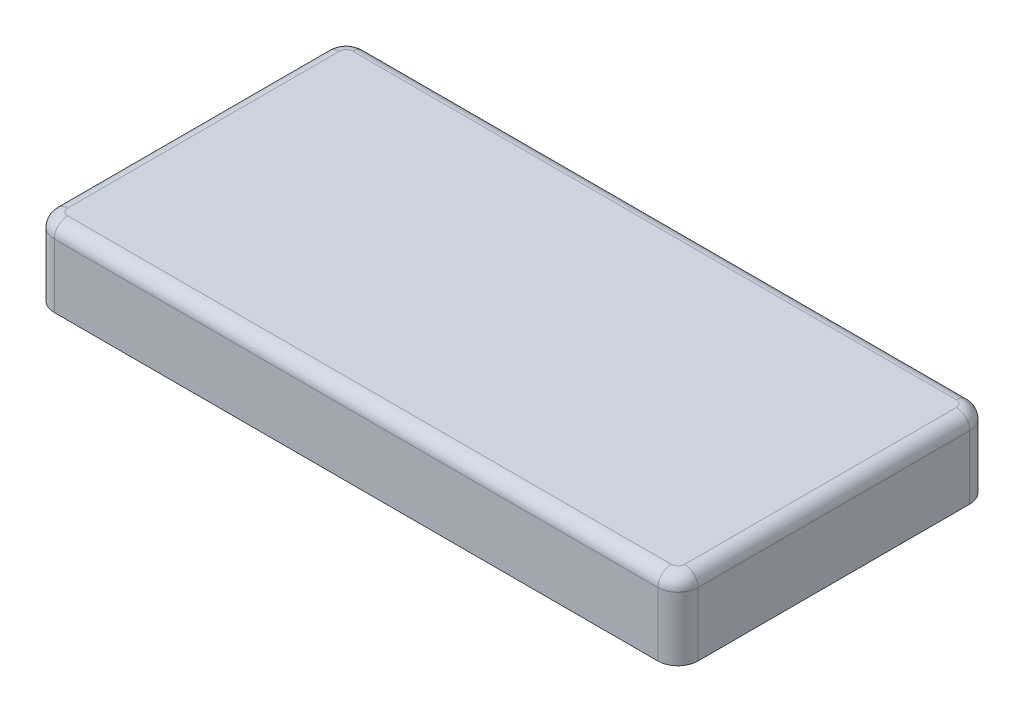
ISO-10303-21;
HEADER;
FILE_DESCRIPTION(('STEP AP214'),'2;1');
FILE_NAME('part.step','',(''),(''),'','','');
FILE_SCHEMA(('AUTOMOTIVE_DESIGN { 1 0 10303 214 1 1 1 1 }'));
ENDSEC;
DATA;
#1=APPLICATION_CONTEXT('core data for automotive mechanical design processes');
#2=APPLICATION_PROTOCOL_DEFINITION('international standard','automotive_design',2000,#1);
#3=PRODUCT_CONTEXT('',#1,'mechanical');
#4=PRODUCT('Part','Part','',(#3));
#5=PRODUCT_RELATED_PRODUCT_CATEGORY('part','',(#4));
#6=PRODUCT_DEFINITION_FORMATION('','',#4);
#7=PRODUCT_DEFINITION_CONTEXT('part definition',#1,'design');
#8=PRODUCT_DEFINITION('design','',#6,#7);
#9=PRODUCT_DEFINITION_SHAPE('','',#8);
#10=(LENGTH_UNIT() NAMED_UNIT(*) SI_UNIT(.MILLI.,.METRE.));
#11=(NAMED_UNIT(*) PLANE_ANGLE_UNIT() SI_UNIT($,.RADIAN.));
#12=(NAMED_UNIT(*) SI_UNIT($,.STERADIAN.) SOLID_ANGLE_UNIT());
#13=UNCERTAINTY_MEASURE_WITH_UNIT(LENGTH_MEASURE(1.E-05),#10,'distance_accuracy_value','');
#14=(GEOMETRIC_REPRESENTATION_CONTEXT(3) GLOBAL_UNCERTAINTY_ASSIGNED_CONTEXT((#13)) GLOBAL_UNIT_ASSIGNED_CONTEXT((#10,
#11,#12)) REPRESENTATION_CONTEXT('',''));
#15=CARTESIAN_POINT('',(0.,0.,0.));
#16=DIRECTION('',(0.,0.,1.));
#17=DIRECTION('',(1.,0.,0.));
#18=AXIS2_PLACEMENT_3D('',#15,#16,#17);
#19=CARTESIAN_POINT('',(0.,5.1,0.));
#20=DIRECTION('',(0.,1.,0.));
#21=DIRECTION('',(0.,0.,1.));
#22=AXIS2_PLACEMENT_3D('',#19,#20,#21);
#23=PLANE('',#22);
#24=DIRECTION('',(0.,0.,1.));
#25=VECTOR('',#24,1.);
#26=CARTESIAN_POINT('',(46.0375,5.1,0.));
#27=LINE('',#26,#25);
#28=CARTESIAN_POINT('',(46.0375,5.1,-20.2725));
#29=VERTEX_POINT('',#28);
#30=CARTESIAN_POINT('',(46.0375,5.1,20.2725));
#31=VERTEX_POINT('',#30);
#32=EDGE_CURVE('E345',#29,#31,#27,.T.);
#33=ORIENTED_EDGE('',*,*,#32,.T.);
#34=CARTESIAN_POINT('',(45.0375,5.1,20.2725));
#35=DIRECTION('',(0.,1.,0.));
#36=DIRECTION('',(0.,0.,1.));
#37=AXIS2_PLACEMENT_3D('',#34,#35,#36);
#38=CIRCLE('',#37,1.);
#39=CARTESIAN_POINT('',(45.0375,5.1,21.2725));
#40=VERTEX_POINT('',#39);
#41=EDGE_CURVE('E347',#31,#40,#38,.F.);
#42=ORIENTED_EDGE('',*,*,#41,.T.);
#43=DIRECTION('',(-1.,0.,0.));
#44=VECTOR('',#43,1.);
#45=CARTESIAN_POINT('',(0.,5.1,21.2725));
#46=LINE('',#45,#44);
#47=CARTESIAN_POINT('',(-45.0375,5.1,21.2725));
#48=VERTEX_POINT('',#47);
#49=EDGE_CURVE('E310',#40,#48,#46,.T.);
#50=ORIENTED_EDGE('',*,*,#49,.T.);
#51=CARTESIAN_POINT('',(-45.0375,5.1,20.2725));
#52=DIRECTION('',(0.,1.,0.));
#53=DIRECTION('',(0.,0.,1.));
#54=AXIS2_PLACEMENT_3D('',#51,#52,#53);
#55=CIRCLE('',#54,1.);
#56=CARTESIAN_POINT('',(-46.0375,5.1,20.2725));
#57=VERTEX_POINT('',#56);
#58=EDGE_CURVE('E335',#48,#57,#55,.F.);
#59=ORIENTED_EDGE('',*,*,#58,.T.);
#60=DIRECTION('',(0.,0.,-1.));
#61=VECTOR('',#60,1.);
#62=CARTESIAN_POINT('',(-46.0375,5.1,0.));
#63=LINE('',#62,#61);
#64=CARTESIAN_POINT('',(-46.0375,5.1,-20.2725));
#65=VERTEX_POINT('',#64);
#66=EDGE_CURVE('E337',#57,#65,#63,.T.);
#67=ORIENTED_EDGE('',*,*,#66,.T.);
#68=CARTESIAN_POINT('',(-45.0375,5.1,-20.2725));
#69=DIRECTION('',(0.,1.,0.));
#70=DIRECTION('',(0.,0.,1.));
#71=AXIS2_PLACEMENT_3D('',#68,#69,#70);
#72=CIRCLE('',#71,1.);
#73=CARTESIAN_POINT('',(-45.0375,5.1,-21.2725));
#74=VERTEX_POINT('',#73);
#75=EDGE_CURVE('E339',#65,#74,#72,.F.);
#76=ORIENTED_EDGE('',*,*,#75,.T.);
#77=DIRECTION('',(1.,0.,0.));
#78=VECTOR('',#77,1.);
#79=CARTESIAN_POINT('',(0.,5.1,-21.2725));
#80=LINE('',#79,#78);
#81=CARTESIAN_POINT('',(45.0375,5.1,-21.2725));
#82=VERTEX_POINT('',#81);
#83=EDGE_CURVE('E341',#74,#82,#80,.T.);
#84=ORIENTED_EDGE('',*,*,#83,.T.);
#85=CARTESIAN_POINT('',(45.0375,5.1,-20.2725));
#86=DIRECTION('',(0.,1.,0.));
#87=DIRECTION('',(0.,0.,1.));
#88=AXIS2_PLACEMENT_3D('',#85,#86,#87);
#89=CIRCLE('',#88,1.);
#90=EDGE_CURVE('E343',#82,#29,#89,.F.);
#91=ORIENTED_EDGE('',*,*,#90,.T.);
#92=EDGE_LOOP('',(#33,#42,#50,#59,#67,#76,#84,#91));
#93=FACE_BOUND('',#92,.T.);
#94=CARTESIAN_POINT('',(41.5925,5.1,16.8275));
#95=DIRECTION('',(0.,1.,0.));
#96=DIRECTION('',(0.,0.,1.));
#97=AXIS2_PLACEMENT_3D('',#94,#95,#96);
#98=CIRCLE('',#97,3.5);
#99=CARTESIAN_POINT('',(41.5925,5.1,20.3275));
#100=VERTEX_POINT('',#99);
#101=EDGE_CURVE('E422',#100,#100,#98,.F.);
#102=ORIENTED_EDGE('',*,*,#101,.F.);
#103=EDGE_LOOP('',(#102));
#104=FACE_BOUND('',#103,.T.);
#105=CARTESIAN_POINT('',(-41.5925,5.1,-16.8275));
#106=DIRECTION('',(0.,1.,0.));
#107=DIRECTION('',(0.,0.,1.));
#108=AXIS2_PLACEMENT_3D('',#105,#106,#107);
#109=CIRCLE('',#108,3.5);
#110=CARTESIAN_POINT('',(-41.5925,5.1,-13.3275));
#111=VERTEX_POINT('',#110);
#112=EDGE_CURVE('E434',#111,#111,#109,.T.);
#113=ORIENTED_EDGE('',*,*,#112,.T.);
#114=EDGE_LOOP('',(#113));
#115=FACE_BOUND('',#114,.T.);
#116=CARTESIAN_POINT('',(-41.5925,5.1,16.8275));
#117=DIRECTION('',(0.,1.,0.));
#118=DIRECTION('',(0.,0.,1.));
#119=AXIS2_PLACEMENT_3D('',#116,#117,#118);
#120=CIRCLE('',#119,3.5);
#121=CARTESIAN_POINT('',(-41.5925,5.1,20.3275));
#122=VERTEX_POINT('',#121);
#123=EDGE_CURVE('E428',#122,#122,#120,.F.);
#124=ORIENTED_EDGE('',*,*,#123,.F.);
#125=EDGE_LOOP('',(#124));
#126=FACE_BOUND('',#125,.T.);
#127=CARTESIAN_POINT('',(41.5925,5.1,-16.8275));
#128=DIRECTION('',(0.,1.,0.));
#129=DIRECTION('',(0.,0.,1.));
#130=AXIS2_PLACEMENT_3D('',#127,#128,#129);
#131=CIRCLE('',#130,3.5);
#132=CARTESIAN_POINT('',(41.5925,5.1,-13.3275));
#133=VERTEX_POINT('',#132);
#134=EDGE_CURVE('E232',#133,#133,#131,.F.);
#135=ORIENTED_EDGE('',*,*,#134,.F.);
#136=EDGE_LOOP('',(#135));
#137=FACE_BOUND('',#136,.T.);
#138=ADVANCED_FACE('F37',(#93,#104,#115,#126,#137),#23,.F.);
#139=CARTESIAN_POINT('',(-41.5925,6.6,-16.8275));
#140=DIRECTION('',(0.,-1.,0.));
#141=DIRECTION('',(0.,0.,-1.));
#142=AXIS2_PLACEMENT_3D('',#139,#140,#141);
#143=CYLINDRICAL_SURFACE('',#142,3.5);
#144=CARTESIAN_POINT('',(-41.5925,1.6,-16.8275));
#145=DIRECTION('',(0.,1.,0.));
#146=DIRECTION('',(0.,0.,1.));
#147=AXIS2_PLACEMENT_3D('',#144,#145,#146);
#148=CIRCLE('',#147,3.5);
#149=CARTESIAN_POINT('',(-41.5925,1.6,-13.3275));
#150=VERTEX_POINT('',#149);
#151=EDGE_CURVE('E431',#150,#150,#148,.T.);
#152=ORIENTED_EDGE('',*,*,#151,.T.);
#153=EDGE_LOOP('',(#152));
#154=FACE_BOUND('',#153,.T.);
#155=ORIENTED_EDGE('',*,*,#112,.F.);
#156=EDGE_LOOP('',(#155));
#157=FACE_BOUND('',#156,.T.);
#158=ADVANCED_FACE('F441',(#154,#157),#143,.T.);
#159=CARTESIAN_POINT('',(-41.5925,1.6,-16.8275));
#160=DIRECTION('',(0.,1.,0.));
#161=DIRECTION('',(0.,0.,1.));
#162=AXIS2_PLACEMENT_3D('',#159,#160,#161);
#163=PLANE('',#162);
#164=ORIENTED_EDGE('',*,*,#151,.F.);
#165=EDGE_LOOP('',(#164));
#166=FACE_BOUND('',#165,.T.);
#167=ADVANCED_FACE('F443',(#166),#163,.F.);
#168=CARTESIAN_POINT('',(-41.5925,6.6,16.8275));
#169=DIRECTION('',(0.,-1.,0.));
#170=DIRECTION('',(0.,0.,-1.));
#171=AXIS2_PLACEMENT_3D('',#168,#169,#170);
#172=CYLINDRICAL_SURFACE('',#171,3.5);
#173=CARTESIAN_POINT('',(-41.5925,1.6,16.8275));
#174=DIRECTION('',(0.,1.,0.));
#175=DIRECTION('',(0.,0.,1.));
#176=AXIS2_PLACEMENT_3D('',#173,#174,#175);
#177=CIRCLE('',#176,3.5);
#178=CARTESIAN_POINT('',(-41.5925,1.6,20.3275));
#179=VERTEX_POINT('',#178);
#180=EDGE_CURVE('E425',#179,#179,#177,.T.);
#181=ORIENTED_EDGE('',*,*,#180,.T.);
#182=EDGE_LOOP('',(#181));
#183=FACE_BOUND('',#182,.T.);
#184=ORIENTED_EDGE('',*,*,#123,.T.);
#185=EDGE_LOOP('',(#184));
#186=FACE_BOUND('',#185,.T.);
#187=ADVANCED_FACE('F450',(#183,#186),#172,.T.);
#188=CARTESIAN_POINT('',(-41.5925,1.6,16.8275));
#189=DIRECTION('',(0.,1.,0.));
#190=DIRECTION('',(0.,0.,1.));
#191=AXIS2_PLACEMENT_3D('',#188,#189,#190);
#192=PLANE('',#191);
#193=ORIENTED_EDGE('',*,*,#180,.F.);
#194=EDGE_LOOP('',(#193));
#195=FACE_BOUND('',#194,.T.);
#196=ADVANCED_FACE('F708',(#195),#192,.F.);
#197=CARTESIAN_POINT('',(41.5925,6.6,16.8275));
#198=DIRECTION('',(0.,-1.,0.));
#199=DIRECTION('',(0.,0.,-1.));
#200=AXIS2_PLACEMENT_3D('',#197,#198,#199);
#201=CYLINDRICAL_SURFACE('',#200,3.5);
#202=CARTESIAN_POINT('',(41.5925,1.6,16.8275));
#203=DIRECTION('',(0.,1.,0.));
#204=DIRECTION('',(0.,0.,1.));
#205=AXIS2_PLACEMENT_3D('',#202,#203,#204);
#206=CIRCLE('',#205,3.5);
#207=CARTESIAN_POINT('',(41.5925,1.6,20.3275));
#208=VERTEX_POINT('',#207);
#209=EDGE_CURVE('E419',#208,#208,#206,.T.);
#210=ORIENTED_EDGE('',*,*,#209,.T.);
#211=EDGE_LOOP('',(#210));
#212=FACE_BOUND('',#211,.T.);
#213=ORIENTED_EDGE('',*,*,#101,.T.);
#214=EDGE_LOOP('',(#213));
#215=FACE_BOUND('',#214,.T.);
#216=ADVANCED_FACE('F700',(#212,#215),#201,.T.);
#217=CARTESIAN_POINT('',(41.5925,1.6,16.8275));
#218=DIRECTION('',(0.,1.,0.));
#219=DIRECTION('',(0.,0.,1.));
#220=AXIS2_PLACEMENT_3D('',#217,#218,#219);
#221=PLANE('',#220);
#222=ORIENTED_EDGE('',*,*,#209,.F.);
#223=EDGE_LOOP('',(#222));
#224=FACE_BOUND('',#223,.T.);
#225=ADVANCED_FACE('F692',(#224),#221,.F.);
#226=CARTESIAN_POINT('',(41.5925,6.6,-16.8275));
#227=DIRECTION('',(0.,-1.,0.));
#228=DIRECTION('',(0.,0.,-1.));
#229=AXIS2_PLACEMENT_3D('',#226,#227,#228);
#230=CYLINDRICAL_SURFACE('',#229,3.5);
#231=CARTESIAN_POINT('',(41.5925,1.6,-16.8275));
#232=DIRECTION('',(0.,1.,0.));
#233=DIRECTION('',(0.,0.,1.));
#234=AXIS2_PLACEMENT_3D('',#231,#232,#233);
#235=CIRCLE('',#234,3.5);
#236=CARTESIAN_POINT('',(41.5925,1.6,-13.3275));
#237=VERTEX_POINT('',#236);
#238=EDGE_CURVE('E416',#237,#237,#235,.T.);
#239=ORIENTED_EDGE('',*,*,#238,.T.);
#240=EDGE_LOOP('',(#239));
#241=FACE_BOUND('',#240,.T.);
#242=ORIENTED_EDGE('',*,*,#134,.T.);
#243=EDGE_LOOP('',(#242));
#244=FACE_BOUND('',#243,.T.);
#245=ADVANCED_FACE('F684',(#241,#244),#230,.T.);
#246=CARTESIAN_POINT('',(41.5925,1.6,-16.8275));
#247=DIRECTION('',(0.,1.,0.));
#248=DIRECTION('',(0.,0.,1.));
#249=AXIS2_PLACEMENT_3D('',#246,#247,#248);
#250=PLANE('',#249);
#251=ORIENTED_EDGE('',*,*,#238,.F.);
#252=EDGE_LOOP('',(#251));
#253=FACE_BOUND('',#252,.T.);
#254=ADVANCED_FACE('F677',(#253),#250,.F.);
#255=CARTESIAN_POINT('',(0.,-4.9,0.));
#256=DIRECTION('',(0.,-1.,0.));
#257=DIRECTION('',(0.,0.,-1.));
#258=AXIS2_PLACEMENT_3D('',#255,#256,#257);
#259=PLANE('',#258);
#260=DIRECTION('',(1.,0.,0.));
#261=VECTOR('',#260,1.);
#262=CARTESIAN_POINT('',(-48.0375,-4.9,-23.2725));
#263=LINE('',#262,#261);
#264=CARTESIAN_POINT('',(-45.0375,-4.9,-23.2725));
#265=VERTEX_POINT('',#264);
#266=CARTESIAN_POINT('',(45.0375,-4.9,-23.2725));
#267=VERTEX_POINT('',#266);
#268=EDGE_CURVE('E208',#265,#267,#263,.T.);
#269=ORIENTED_EDGE('',*,*,#268,.T.);
#270=CARTESIAN_POINT('',(45.0375,-4.9,-20.2725));
#271=DIRECTION('',(0.,-1.,0.));
#272=DIRECTION('',(0.,0.,-1.));
#273=AXIS2_PLACEMENT_3D('',#270,#271,#272);
#274=CIRCLE('',#273,3.);
#275=CARTESIAN_POINT('',(48.0375,-4.9,-20.2725));
#276=VERTEX_POINT('',#275);
#277=EDGE_CURVE('E201',#267,#276,#274,.T.);
#278=ORIENTED_EDGE('',*,*,#277,.T.);
#279=DIRECTION('',(0.,0.,1.));
#280=VECTOR('',#279,1.);
#281=CARTESIAN_POINT('',(48.0375,-4.9,-23.2725));
#282=LINE('',#281,#280);
#283=CARTESIAN_POINT('',(48.0375,-4.9,20.2725));
#284=VERTEX_POINT('',#283);
#285=EDGE_CURVE('E205',#276,#284,#282,.T.);
#286=ORIENTED_EDGE('',*,*,#285,.T.);
#287=CARTESIAN_POINT('',(45.0375,-4.9,20.2725));
#288=DIRECTION('',(0.,-1.,0.));
#289=DIRECTION('',(0.,0.,-1.));
#290=AXIS2_PLACEMENT_3D('',#287,#288,#289);
#291=CIRCLE('',#290,3.);
#292=CARTESIAN_POINT('',(45.0375,-4.9,23.2725));
#293=VERTEX_POINT('',#292);
#294=EDGE_CURVE('E237',#284,#293,#291,.T.);
#295=ORIENTED_EDGE('',*,*,#294,.T.);
#296=DIRECTION('',(-1.,0.,0.));
#297=VECTOR('',#296,1.);
#298=CARTESIAN_POINT('',(48.0375,-4.9,23.2725));
#299=LINE('',#298,#297);
#300=CARTESIAN_POINT('',(-45.0375,-4.9,23.2725));
#301=VERTEX_POINT('',#300);
#302=EDGE_CURVE('E222',#293,#301,#299,.T.);
#303=ORIENTED_EDGE('',*,*,#302,.T.);
#304=CARTESIAN_POINT('',(-45.0375,-4.9,20.2725));
#305=DIRECTION('',(0.,-1.,0.));
#306=DIRECTION('',(0.,0.,-1.));
#307=AXIS2_PLACEMENT_3D('',#304,#305,#306);
#308=CIRCLE('',#307,3.);
#309=CARTESIAN_POINT('',(-48.0375,-4.9,20.2725));
#310=VERTEX_POINT('',#309);
#311=EDGE_CURVE('E239',#301,#310,#308,.T.);
#312=ORIENTED_EDGE('',*,*,#311,.T.);
#313=DIRECTION('',(0.,0.,-1.));
#314=VECTOR('',#313,1.);
#315=CARTESIAN_POINT('',(-48.0375,-4.9,23.2725));
#316=LINE('',#315,#314);
#317=CARTESIAN_POINT('',(-48.0375,-4.9,-20.2725));
#318=VERTEX_POINT('',#317);
#319=EDGE_CURVE('E413',#310,#318,#316,.T.);
#320=ORIENTED_EDGE('',*,*,#319,.T.);
#321=CARTESIAN_POINT('',(-45.0375,-4.9,-20.2725));
#322=DIRECTION('',(0.,-1.,0.));
#323=DIRECTION('',(0.,0.,-1.));
#324=AXIS2_PLACEMENT_3D('',#321,#322,#323);
#325=CIRCLE('',#324,3.);
#326=EDGE_CURVE('E213',#318,#265,#325,.T.);
#327=ORIENTED_EDGE('',*,*,#326,.T.);
#328=EDGE_LOOP('',(#269,#278,#286,#295,#303,#312,#320,#327));
#329=FACE_BOUND('',#328,.T.);
#330=DIRECTION('',(0.,0.,1.));
#331=VECTOR('',#330,1.);
#332=CARTESIAN_POINT('',(46.5375,-4.9,-21.7725));
#333=LINE('',#332,#331);
#334=CARTESIAN_POINT('',(46.5375,-4.9,-20.2725));
#335=VERTEX_POINT('',#334);
#336=CARTESIAN_POINT('',(46.5375,-4.9,20.2725));
#337=VERTEX_POINT('',#336);
#338=EDGE_CURVE('E407',#335,#337,#333,.T.);
#339=ORIENTED_EDGE('',*,*,#338,.F.);
#340=CARTESIAN_POINT('',(45.0375,-4.9,-20.2725));
#341=DIRECTION('',(0.,-1.,0.));
#342=DIRECTION('',(0.,0.,-1.));
#343=AXIS2_PLACEMENT_3D('',#340,#341,#342);
#344=CIRCLE('',#343,1.5);
#345=CARTESIAN_POINT('',(45.0375,-4.9,-21.7725));
#346=VERTEX_POINT('',#345);
#347=EDGE_CURVE('E273',#335,#346,#344,.F.);
#348=ORIENTED_EDGE('',*,*,#347,.T.);
#349=DIRECTION('',(1.,0.,0.));
#350=VECTOR('',#349,1.);
#351=CARTESIAN_POINT('',(-46.5375,-4.9,-21.7725));
#352=LINE('',#351,#350);
#353=CARTESIAN_POINT('',(-45.0375,-4.9,-21.7725));
#354=VERTEX_POINT('',#353);
#355=EDGE_CURVE('E333',#354,#346,#352,.T.);
#356=ORIENTED_EDGE('',*,*,#355,.F.);
#357=CARTESIAN_POINT('',(-45.0375,-4.9,-20.2725));
#358=DIRECTION('',(0.,-1.,0.));
#359=DIRECTION('',(0.,0.,-1.));
#360=AXIS2_PLACEMENT_3D('',#357,#358,#359);
#361=CIRCLE('',#360,1.5);
#362=CARTESIAN_POINT('',(-46.5375,-4.9,-20.2725));
#363=VERTEX_POINT('',#362);
#364=EDGE_CURVE('E269',#354,#363,#361,.F.);
#365=ORIENTED_EDGE('',*,*,#364,.T.);
#366=DIRECTION('',(0.,0.,-1.));
#367=VECTOR('',#366,1.);
#368=CARTESIAN_POINT('',(-46.5375,-4.9,21.7725));
#369=LINE('',#368,#367);
#370=CARTESIAN_POINT('',(-46.5375,-4.9,20.2725));
#371=VERTEX_POINT('',#370);
#372=EDGE_CURVE('E401',#371,#363,#369,.T.);
#373=ORIENTED_EDGE('',*,*,#372,.F.);
#374=CARTESIAN_POINT('',(-45.0375,-4.9,20.2725));
#375=DIRECTION('',(0.,-1.,0.));
#376=DIRECTION('',(0.,0.,-1.));
#377=AXIS2_PLACEMENT_3D('',#374,#375,#376);
#378=CIRCLE('',#377,1.5);
#379=CARTESIAN_POINT('',(-45.0375,-4.9,21.7725));
#380=VERTEX_POINT('',#379);
#381=EDGE_CURVE('E271',#371,#380,#378,.F.);
#382=ORIENTED_EDGE('',*,*,#381,.T.);
#383=DIRECTION('',(-1.,0.,0.));
#384=VECTOR('',#383,1.);
#385=CARTESIAN_POINT('',(46.5375,-4.9,21.7725));
#386=LINE('',#385,#384);
#387=CARTESIAN_POINT('',(45.0375,-4.9,21.7725));
#388=VERTEX_POINT('',#387);
#389=EDGE_CURVE('E403',#388,#380,#386,.T.);
#390=ORIENTED_EDGE('',*,*,#389,.F.);
#391=CARTESIAN_POINT('',(45.0375,-4.9,20.2725));
#392=DIRECTION('',(0.,-1.,0.));
#393=DIRECTION('',(0.,0.,-1.));
#394=AXIS2_PLACEMENT_3D('',#391,#392,#393);
#395=CIRCLE('',#394,1.5);
#396=EDGE_CURVE('E275',#388,#337,#395,.F.);
#397=ORIENTED_EDGE('',*,*,#396,.T.);
#398=EDGE_LOOP('',(#339,#348,#356,#365,#373,#382,#390,#397));
#399=FACE_BOUND('',#398,.T.);
#400=ADVANCED_FACE('F203',(#329,#399),#259,.T.);
#401=CARTESIAN_POINT('',(-46.5375,-4.9,-21.7725));
#402=DIRECTION('',(0.,0.,1.));
#403=DIRECTION('',(1.,0.,0.));
#404=AXIS2_PLACEMENT_3D('',#401,#402,#403);
#405=PLANE('',#404);
#406=DIRECTION('',(0.,1.,0.));
#407=VECTOR('',#406,1.);
#408=CARTESIAN_POINT('',(45.0375,5.1,-21.7725));
#409=LINE('',#408,#407);
#410=CARTESIAN_POINT('',(45.0375,4.6,-21.7725));
#411=VERTEX_POINT('',#410);
#412=EDGE_CURVE('E255',#346,#411,#409,.T.);
#413=ORIENTED_EDGE('',*,*,#412,.T.);
#414=DIRECTION('',(1.,0.,0.));
#415=VECTOR('',#414,1.);
#416=CARTESIAN_POINT('',(-46.5375,4.6,-21.7725));
#417=LINE('',#416,#415);
#418=CARTESIAN_POINT('',(-45.0375,4.6,-21.7725));
#419=VERTEX_POINT('',#418);
#420=EDGE_CURVE('E357',#411,#419,#417,.F.);
#421=ORIENTED_EDGE('',*,*,#420,.T.);
#422=DIRECTION('',(0.,1.,0.));
#423=VECTOR('',#422,1.);
#424=CARTESIAN_POINT('',(-45.0375,-4.9,-21.7725));
#425=LINE('',#424,#423);
#426=EDGE_CURVE('E258',#419,#354,#425,.F.);
#427=ORIENTED_EDGE('',*,*,#426,.T.);
#428=ORIENTED_EDGE('',*,*,#355,.T.);
#429=EDGE_LOOP('',(#413,#421,#427,#428));
#430=FACE_BOUND('',#429,.T.);
#431=ADVANCED_FACE('F662',(#430),#405,.T.);
#432=CARTESIAN_POINT('',(46.5375,-4.9,-21.7725));
#433=DIRECTION('',(-1.,0.,0.));
#434=DIRECTION('',(0.,0.,1.));
#435=AXIS2_PLACEMENT_3D('',#432,#433,#434);
#436=PLANE('',#435);
#437=DIRECTION('',(0.,1.,0.));
#438=VECTOR('',#437,1.);
#439=CARTESIAN_POINT('',(46.5375,5.1,20.2725));
#440=LINE('',#439,#438);
#441=CARTESIAN_POINT('',(46.5375,4.6,20.2725));
#442=VERTEX_POINT('',#441);
#443=EDGE_CURVE('E264',#337,#442,#440,.T.);
#444=ORIENTED_EDGE('',*,*,#443,.T.);
#445=DIRECTION('',(0.,0.,1.));
#446=VECTOR('',#445,1.);
#447=CARTESIAN_POINT('',(46.5375,4.6,-21.7725));
#448=LINE('',#447,#446);
#449=CARTESIAN_POINT('',(46.5375,4.6,-20.2725));
#450=VERTEX_POINT('',#449);
#451=EDGE_CURVE('E353',#442,#450,#448,.F.);
#452=ORIENTED_EDGE('',*,*,#451,.T.);
#453=DIRECTION('',(0.,1.,0.));
#454=VECTOR('',#453,1.);
#455=CARTESIAN_POINT('',(46.5375,-4.9,-20.2725));
#456=LINE('',#455,#454);
#457=EDGE_CURVE('E267',#450,#335,#456,.F.);
#458=ORIENTED_EDGE('',*,*,#457,.T.);
#459=ORIENTED_EDGE('',*,*,#338,.T.);
#460=EDGE_LOOP('',(#444,#452,#458,#459));
#461=FACE_BOUND('',#460,.T.);
#462=ADVANCED_FACE('F654',(#461),#436,.T.);
#463=CARTESIAN_POINT('',(46.5375,-4.9,21.7725));
#464=DIRECTION('',(0.,0.,-1.));
#465=DIRECTION('',(-1.,0.,0.));
#466=AXIS2_PLACEMENT_3D('',#463,#464,#465);
#467=PLANE('',#466);
#468=DIRECTION('',(0.,1.,0.));
#469=VECTOR('',#468,1.);
#470=CARTESIAN_POINT('',(-45.0375,5.1,21.7725));
#471=LINE('',#470,#469);
#472=CARTESIAN_POINT('',(-45.0375,4.6,21.7725));
#473=VERTEX_POINT('',#472);
#474=EDGE_CURVE('E262',#380,#473,#471,.T.);
#475=ORIENTED_EDGE('',*,*,#474,.T.);
#476=DIRECTION('',(-1.,0.,0.));
#477=VECTOR('',#476,1.);
#478=CARTESIAN_POINT('',(46.5375,4.6,21.7725));
#479=LINE('',#478,#477);
#480=CARTESIAN_POINT('',(45.0375,4.6,21.7725));
#481=VERTEX_POINT('',#480);
#482=EDGE_CURVE('E11',#473,#481,#479,.F.);
#483=ORIENTED_EDGE('',*,*,#482,.T.);
#484=DIRECTION('',(0.,1.,0.));
#485=VECTOR('',#484,1.);
#486=CARTESIAN_POINT('',(45.0375,-4.9,21.7725));
#487=LINE('',#486,#485);
#488=EDGE_CURVE('E260',#481,#388,#487,.F.);
#489=ORIENTED_EDGE('',*,*,#488,.T.);
#490=ORIENTED_EDGE('',*,*,#389,.T.);
#491=EDGE_LOOP('',(#475,#483,#489,#490));
#492=FACE_BOUND('',#491,.T.);
#493=ADVANCED_FACE('F647',(#492),#467,.T.);
#494=CARTESIAN_POINT('',(-46.5375,-4.9,21.7725));
#495=DIRECTION('',(1.,0.,0.));
#496=DIRECTION('',(0.,0.,-1.));
#497=AXIS2_PLACEMENT_3D('',#494,#495,#496);
#498=PLANE('',#497);
#499=DIRECTION('',(0.,1.,0.));
#500=VECTOR('',#499,1.);
#501=CARTESIAN_POINT('',(-46.5375,5.1,-20.2725));
#502=LINE('',#501,#500);
#503=CARTESIAN_POINT('',(-46.5375,4.6,-20.2725));
#504=VERTEX_POINT('',#503);
#505=EDGE_CURVE('E253',#363,#504,#502,.T.);
#506=ORIENTED_EDGE('',*,*,#505,.T.);
#507=DIRECTION('',(0.,0.,-1.));
#508=VECTOR('',#507,1.);
#509=CARTESIAN_POINT('',(-46.5375,4.6,21.7725));
#510=LINE('',#509,#508);
#511=CARTESIAN_POINT('',(-46.5375,4.6,20.2725));
#512=VERTEX_POINT('',#511);
#513=EDGE_CURVE('E61',#504,#512,#510,.F.);
#514=ORIENTED_EDGE('',*,*,#513,.T.);
#515=DIRECTION('',(0.,1.,0.));
#516=VECTOR('',#515,1.);
#517=CARTESIAN_POINT('',(-46.5375,-4.9,20.2725));
#518=LINE('',#517,#516);
#519=EDGE_CURVE('E251',#512,#371,#518,.F.);
#520=ORIENTED_EDGE('',*,*,#519,.T.);
#521=ORIENTED_EDGE('',*,*,#372,.T.);
#522=EDGE_LOOP('',(#506,#514,#520,#521));
#523=FACE_BOUND('',#522,.T.);
#524=ADVANCED_FACE('F399',(#523),#498,.T.);
#525=CARTESIAN_POINT('',(-41.5925,6.6,-16.8275));
#526=DIRECTION('',(0.,1.,0.));
#527=DIRECTION('',(0.,0.,1.));
#528=AXIS2_PLACEMENT_3D('',#525,#526,#527);
#529=PLANE('',#528);
#530=DIRECTION('',(0.,0.,1.));
#531=VECTOR('',#530,1.);
#532=CARTESIAN_POINT('',(-46.0375,6.6,-16.8275));
#533=LINE('',#532,#531);
#534=CARTESIAN_POINT('',(-46.0375,6.6,-20.2725));
#535=VERTEX_POINT('',#534);
#536=CARTESIAN_POINT('',(-46.0375,6.6,20.2725));
#537=VERTEX_POINT('',#536);
#538=EDGE_CURVE('E289',#535,#537,#533,.T.);
#539=ORIENTED_EDGE('',*,*,#538,.T.);
#540=CARTESIAN_POINT('',(-45.0375,6.6,20.2725));
#541=DIRECTION('',(0.,1.,0.));
#542=DIRECTION('',(0.,0.,1.));
#543=AXIS2_PLACEMENT_3D('',#540,#541,#542);
#544=CIRCLE('',#543,1.);
#545=CARTESIAN_POINT('',(-45.0375,6.6,21.2725));
#546=VERTEX_POINT('',#545);
#547=EDGE_CURVE('E291',#537,#546,#544,.T.);
#548=ORIENTED_EDGE('',*,*,#547,.T.);
#549=DIRECTION('',(1.,0.,0.));
#550=VECTOR('',#549,1.);
#551=CARTESIAN_POINT('',(-41.5925,6.6,21.2725));
#552=LINE('',#551,#550);
#553=CARTESIAN_POINT('',(45.0375,6.6,21.2725));
#554=VERTEX_POINT('',#553);
#555=EDGE_CURVE('E277',#546,#554,#552,.T.);
#556=ORIENTED_EDGE('',*,*,#555,.T.);
#557=CARTESIAN_POINT('',(45.0375,6.6,20.2725));
#558=DIRECTION('',(0.,1.,0.));
#559=DIRECTION('',(0.,0.,1.));
#560=AXIS2_PLACEMENT_3D('',#557,#558,#559);
#561=CIRCLE('',#560,1.);
#562=CARTESIAN_POINT('',(46.0375,6.6,20.2725));
#563=VERTEX_POINT('',#562);
#564=EDGE_CURVE('E279',#554,#563,#561,.T.);
#565=ORIENTED_EDGE('',*,*,#564,.T.);
#566=DIRECTION('',(0.,0.,-1.));
#567=VECTOR('',#566,1.);
#568=CARTESIAN_POINT('',(46.0375,6.6,-16.8275));
#569=LINE('',#568,#567);
#570=CARTESIAN_POINT('',(46.0375,6.6,-20.2725));
#571=VERTEX_POINT('',#570);
#572=EDGE_CURVE('E281',#563,#571,#569,.T.);
#573=ORIENTED_EDGE('',*,*,#572,.T.);
#574=CARTESIAN_POINT('',(45.0375,6.6,-20.2725));
#575=DIRECTION('',(0.,1.,0.));
#576=DIRECTION('',(0.,0.,1.));
#577=AXIS2_PLACEMENT_3D('',#574,#575,#576);
#578=CIRCLE('',#577,1.);
#579=CARTESIAN_POINT('',(45.0375,6.6,-21.2725));
#580=VERTEX_POINT('',#579);
#581=EDGE_CURVE('E283',#571,#580,#578,.T.);
#582=ORIENTED_EDGE('',*,*,#581,.T.);
#583=DIRECTION('',(-1.,0.,0.));
#584=VECTOR('',#583,1.);
#585=CARTESIAN_POINT('',(-41.5925,6.6,-21.2725));
#586=LINE('',#585,#584);
#587=CARTESIAN_POINT('',(-45.0375,6.6,-21.2725));
#588=VERTEX_POINT('',#587);
#589=EDGE_CURVE('E285',#580,#588,#586,.T.);
#590=ORIENTED_EDGE('',*,*,#589,.T.);
#591=CARTESIAN_POINT('',(-45.0375,6.6,-20.2725));
#592=DIRECTION('',(0.,1.,0.));
#593=DIRECTION('',(0.,0.,1.));
#594=AXIS2_PLACEMENT_3D('',#591,#592,#593);
#595=CIRCLE('',#594,1.);
#596=EDGE_CURVE('E287',#588,#535,#595,.T.);
#597=ORIENTED_EDGE('',*,*,#596,.T.);
#598=EDGE_LOOP('',(#539,#548,#556,#565,#573,#582,#590,#597));
#599=FACE_BOUND('',#598,.T.);
#600=ADVANCED_FACE('F639',(#599),#529,.T.);
#601=CARTESIAN_POINT('',(-48.0375,5.1,-23.2725));
#602=DIRECTION('',(0.,0.,-1.));
#603=DIRECTION('',(-1.,0.,0.));
#604=AXIS2_PLACEMENT_3D('',#601,#602,#603);
#605=PLANE('',#604);
#606=DIRECTION('',(0.,1.,0.));
#607=VECTOR('',#606,1.);
#608=CARTESIAN_POINT('',(-45.0375,5.1,-23.2725));
#609=LINE('',#608,#607);
#610=CARTESIAN_POINT('',(-45.0375,4.6,-23.2725));
#611=VERTEX_POINT('',#610);
#612=EDGE_CURVE('E227',#265,#611,#609,.T.);
#613=ORIENTED_EDGE('',*,*,#612,.T.);
#614=DIRECTION('',(-1.,0.,0.));
#615=VECTOR('',#614,1.);
#616=CARTESIAN_POINT('',(-48.0375,4.6,-23.2725));
#617=LINE('',#616,#615);
#618=CARTESIAN_POINT('',(45.0375,4.6,-23.2725));
#619=VERTEX_POINT('',#618);
#620=EDGE_CURVE('E301',#611,#619,#617,.F.);
#621=ORIENTED_EDGE('',*,*,#620,.T.);
#622=DIRECTION('',(0.,1.,0.));
#623=VECTOR('',#622,1.);
#624=CARTESIAN_POINT('',(45.0375,5.1,-23.2725));
#625=LINE('',#624,#623);
#626=EDGE_CURVE('E230',#619,#267,#625,.F.);
#627=ORIENTED_EDGE('',*,*,#626,.T.);
#628=ORIENTED_EDGE('',*,*,#268,.F.);
#629=EDGE_LOOP('',(#613,#621,#627,#628));
#630=FACE_BOUND('',#629,.T.);
#631=ADVANCED_FACE('F631',(#630),#605,.T.);
#632=CARTESIAN_POINT('',(-48.0375,5.1,-23.2725));
#633=DIRECTION('',(-1.,0.,0.));
#634=DIRECTION('',(0.,0.,1.));
#635=AXIS2_PLACEMENT_3D('',#632,#633,#634);
#636=PLANE('',#635);
#637=DIRECTION('',(0.,1.,0.));
#638=VECTOR('',#637,1.);
#639=CARTESIAN_POINT('',(-48.0375,5.1,20.2725));
#640=LINE('',#639,#638);
#641=CARTESIAN_POINT('',(-48.0375,4.6,20.2725));
#642=VERTEX_POINT('',#641);
#643=EDGE_CURVE('E212',#310,#642,#640,.T.);
#644=ORIENTED_EDGE('',*,*,#643,.T.);
#645=DIRECTION('',(0.,0.,1.));
#646=VECTOR('',#645,1.);
#647=CARTESIAN_POINT('',(-48.0375,4.6,-23.2725));
#648=LINE('',#647,#646);
#649=CARTESIAN_POINT('',(-48.0375,4.6,-20.2725));
#650=VERTEX_POINT('',#649);
#651=EDGE_CURVE('E297',#642,#650,#648,.F.);
#652=ORIENTED_EDGE('',*,*,#651,.T.);
#653=DIRECTION('',(0.,1.,0.));
#654=VECTOR('',#653,1.);
#655=CARTESIAN_POINT('',(-48.0375,5.1,-20.2725));
#656=LINE('',#655,#654);
#657=EDGE_CURVE('E244',#650,#318,#656,.F.);
#658=ORIENTED_EDGE('',*,*,#657,.T.);
#659=ORIENTED_EDGE('',*,*,#319,.F.);
#660=EDGE_LOOP('',(#644,#652,#658,#659));
#661=FACE_BOUND('',#660,.T.);
#662=ADVANCED_FACE('F623',(#661),#636,.T.);
#663=CARTESIAN_POINT('',(-48.0375,5.1,23.2725));
#664=DIRECTION('',(0.,0.,1.));
#665=DIRECTION('',(1.,0.,0.));
#666=AXIS2_PLACEMENT_3D('',#663,#664,#665);
#667=PLANE('',#666);
#668=DIRECTION('',(0.,1.,0.));
#669=VECTOR('',#668,1.);
#670=CARTESIAN_POINT('',(45.0375,5.1,23.2725));
#671=LINE('',#670,#669);
#672=CARTESIAN_POINT('',(45.0375,4.6,23.2725));
#673=VERTEX_POINT('',#672);
#674=EDGE_CURVE('E246',#293,#673,#671,.T.);
#675=ORIENTED_EDGE('',*,*,#674,.T.);
#676=DIRECTION('',(1.,0.,0.));
#677=VECTOR('',#676,1.);
#678=CARTESIAN_POINT('',(-48.0375,4.6,23.2725));
#679=LINE('',#678,#677);
#680=CARTESIAN_POINT('',(-45.0375,4.6,23.2725));
#681=VERTEX_POINT('',#680);
#682=EDGE_CURVE('E308',#673,#681,#679,.F.);
#683=ORIENTED_EDGE('',*,*,#682,.T.);
#684=DIRECTION('',(0.,1.,0.));
#685=VECTOR('',#684,1.);
#686=CARTESIAN_POINT('',(-45.0375,5.1,23.2725));
#687=LINE('',#686,#685);
#688=EDGE_CURVE('E249',#681,#301,#687,.F.);
#689=ORIENTED_EDGE('',*,*,#688,.T.);
#690=ORIENTED_EDGE('',*,*,#302,.F.);
#691=EDGE_LOOP('',(#675,#683,#689,#690));
#692=FACE_BOUND('',#691,.T.);
#693=ADVANCED_FACE('F616',(#692),#667,.T.);
#694=CARTESIAN_POINT('',(48.0375,5.1,-23.2725));
#695=DIRECTION('',(1.,0.,0.));
#696=DIRECTION('',(0.,0.,-1.));
#697=AXIS2_PLACEMENT_3D('',#694,#695,#696);
#698=PLANE('',#697);
#699=DIRECTION('',(0.,1.,0.));
#700=VECTOR('',#699,1.);
#701=CARTESIAN_POINT('',(48.0375,5.1,-20.2725));
#702=LINE('',#701,#700);
#703=CARTESIAN_POINT('',(48.0375,4.6,-20.2725));
#704=VERTEX_POINT('',#703);
#705=EDGE_CURVE('E218',#276,#704,#702,.T.);
#706=ORIENTED_EDGE('',*,*,#705,.T.);
#707=DIRECTION('',(0.,0.,-1.));
#708=VECTOR('',#707,1.);
#709=CARTESIAN_POINT('',(48.0375,4.6,-23.2725));
#710=LINE('',#709,#708);
#711=CARTESIAN_POINT('',(48.0375,4.6,20.2725));
#712=VERTEX_POINT('',#711);
#713=EDGE_CURVE('E304',#704,#712,#710,.F.);
#714=ORIENTED_EDGE('',*,*,#713,.T.);
#715=DIRECTION('',(0.,1.,0.));
#716=VECTOR('',#715,1.);
#717=CARTESIAN_POINT('',(48.0375,5.1,20.2725));
#718=LINE('',#717,#716);
#719=EDGE_CURVE('E221',#712,#284,#718,.F.);
#720=ORIENTED_EDGE('',*,*,#719,.T.);
#721=ORIENTED_EDGE('',*,*,#285,.F.);
#722=EDGE_LOOP('',(#706,#714,#720,#721));
#723=FACE_BOUND('',#722,.T.);
#724=ADVANCED_FACE('F217',(#723),#698,.T.);
#725=CARTESIAN_POINT('',(45.0375,5.1,-20.2725));
#726=DIRECTION('',(0.,1.,0.));
#727=DIRECTION('',(0.,0.,1.));
#728=AXIS2_PLACEMENT_3D('',#725,#726,#727);
#729=CYLINDRICAL_SURFACE('',#728,3.);
#730=ORIENTED_EDGE('',*,*,#626,.F.);
#731=CARTESIAN_POINT('',(45.0375,4.6,-20.2725));
#732=DIRECTION('',(0.,1.,0.));
#733=DIRECTION('',(0.,0.,1.));
#734=AXIS2_PLACEMENT_3D('',#731,#732,#733);
#735=CIRCLE('',#734,3.);
#736=EDGE_CURVE('E226',#619,#704,#735,.F.);
#737=ORIENTED_EDGE('',*,*,#736,.T.);
#738=ORIENTED_EDGE('',*,*,#705,.F.);
#739=ORIENTED_EDGE('',*,*,#277,.F.);
#740=EDGE_LOOP('',(#730,#737,#738,#739));
#741=FACE_BOUND('',#740,.T.);
#742=ADVANCED_FACE('F224',(#741),#729,.T.);
#743=CARTESIAN_POINT('',(-45.0375,5.1,-20.2725));
#744=DIRECTION('',(0.,1.,0.));
#745=DIRECTION('',(0.,0.,1.));
#746=AXIS2_PLACEMENT_3D('',#743,#744,#745);
#747=CYLINDRICAL_SURFACE('',#746,3.);
#748=ORIENTED_EDGE('',*,*,#657,.F.);
#749=CARTESIAN_POINT('',(-45.0375,4.6,-20.2725));
#750=DIRECTION('',(0.,1.,0.));
#751=DIRECTION('',(0.,0.,1.));
#752=AXIS2_PLACEMENT_3D('',#749,#750,#751);
#753=CIRCLE('',#752,3.);
#754=EDGE_CURVE('E299',#650,#611,#753,.F.);
#755=ORIENTED_EDGE('',*,*,#754,.T.);
#756=ORIENTED_EDGE('',*,*,#612,.F.);
#757=ORIENTED_EDGE('',*,*,#326,.F.);
#758=EDGE_LOOP('',(#748,#755,#756,#757));
#759=FACE_BOUND('',#758,.T.);
#760=ADVANCED_FACE('F460',(#759),#747,.T.);
#761=CARTESIAN_POINT('',(-45.0375,5.1,20.2725));
#762=DIRECTION('',(0.,1.,0.));
#763=DIRECTION('',(0.,0.,1.));
#764=AXIS2_PLACEMENT_3D('',#761,#762,#763);
#765=CYLINDRICAL_SURFACE('',#764,3.);
#766=ORIENTED_EDGE('',*,*,#688,.F.);
#767=CARTESIAN_POINT('',(-45.0375,4.6,20.2725));
#768=DIRECTION('',(0.,1.,0.));
#769=DIRECTION('',(0.,0.,1.));
#770=AXIS2_PLACEMENT_3D('',#767,#768,#769);
#771=CIRCLE('',#770,3.);
#772=EDGE_CURVE('E294',#681,#642,#771,.F.);
#773=ORIENTED_EDGE('',*,*,#772,.T.);
#774=ORIENTED_EDGE('',*,*,#643,.F.);
#775=ORIENTED_EDGE('',*,*,#311,.F.);
#776=EDGE_LOOP('',(#766,#773,#774,#775));
#777=FACE_BOUND('',#776,.T.);
#778=ADVANCED_FACE('F463',(#777),#765,.T.);
#779=CARTESIAN_POINT('',(45.0375,5.1,20.2725));
#780=DIRECTION('',(0.,1.,0.));
#781=DIRECTION('',(0.,0.,1.));
#782=AXIS2_PLACEMENT_3D('',#779,#780,#781);
#783=CYLINDRICAL_SURFACE('',#782,3.);
#784=ORIENTED_EDGE('',*,*,#719,.F.);
#785=CARTESIAN_POINT('',(45.0375,4.6,20.2725));
#786=DIRECTION('',(0.,1.,0.));
#787=DIRECTION('',(0.,0.,1.));
#788=AXIS2_PLACEMENT_3D('',#785,#786,#787);
#789=CIRCLE('',#788,3.);
#790=EDGE_CURVE('E306',#712,#673,#789,.F.);
#791=ORIENTED_EDGE('',*,*,#790,.T.);
#792=ORIENTED_EDGE('',*,*,#674,.F.);
#793=ORIENTED_EDGE('',*,*,#294,.F.);
#794=EDGE_LOOP('',(#784,#791,#792,#793));
#795=FACE_BOUND('',#794,.T.);
#796=ADVANCED_FACE('F467',(#795),#783,.T.);
#797=CARTESIAN_POINT('',(-45.0375,-4.9,-20.2725));
#798=DIRECTION('',(0.,-1.,0.));
#799=DIRECTION('',(0.,0.,-1.));
#800=AXIS2_PLACEMENT_3D('',#797,#798,#799);
#801=CYLINDRICAL_SURFACE('',#800,1.5);
#802=ORIENTED_EDGE('',*,*,#426,.F.);
#803=CARTESIAN_POINT('',(-45.0375,4.6,-20.2725));
#804=DIRECTION('',(0.,1.,0.));
#805=DIRECTION('',(0.,0.,1.));
#806=AXIS2_PLACEMENT_3D('',#803,#804,#805);
#807=CIRCLE('',#806,1.5);
#808=EDGE_CURVE('E359',#419,#504,#807,.T.);
#809=ORIENTED_EDGE('',*,*,#808,.T.);
#810=ORIENTED_EDGE('',*,*,#505,.F.);
#811=ORIENTED_EDGE('',*,*,#364,.F.);
#812=EDGE_LOOP('',(#802,#809,#810,#811));
#813=FACE_BOUND('',#812,.T.);
#814=ADVANCED_FACE('F396',(#813),#801,.F.);
#815=CARTESIAN_POINT('',(-45.0375,-4.9,20.2725));
#816=DIRECTION('',(0.,-1.,0.));
#817=DIRECTION('',(0.,0.,-1.));
#818=AXIS2_PLACEMENT_3D('',#815,#816,#817);
#819=CYLINDRICAL_SURFACE('',#818,1.5);
#820=ORIENTED_EDGE('',*,*,#519,.F.);
#821=CARTESIAN_POINT('',(-45.0375,4.6,20.2725));
#822=DIRECTION('',(0.,1.,0.));
#823=DIRECTION('',(0.,0.,1.));
#824=AXIS2_PLACEMENT_3D('',#821,#822,#823);
#825=CIRCLE('',#824,1.5);
#826=EDGE_CURVE('E46',#512,#473,#825,.T.);
#827=ORIENTED_EDGE('',*,*,#826,.T.);
#828=ORIENTED_EDGE('',*,*,#474,.F.);
#829=ORIENTED_EDGE('',*,*,#381,.F.);
#830=EDGE_LOOP('',(#820,#827,#828,#829));
#831=FACE_BOUND('',#830,.T.);
#832=ADVANCED_FACE('F474',(#831),#819,.F.);
#833=CARTESIAN_POINT('',(45.0375,-4.9,-20.2725));
#834=DIRECTION('',(0.,-1.,0.));
#835=DIRECTION('',(0.,0.,-1.));
#836=AXIS2_PLACEMENT_3D('',#833,#834,#835);
#837=CYLINDRICAL_SURFACE('',#836,1.5);
#838=ORIENTED_EDGE('',*,*,#457,.F.);
#839=CARTESIAN_POINT('',(45.0375,4.6,-20.2725));
#840=DIRECTION('',(0.,1.,0.));
#841=DIRECTION('',(0.,0.,1.));
#842=AXIS2_PLACEMENT_3D('',#839,#840,#841);
#843=CIRCLE('',#842,1.5);
#844=EDGE_CURVE('E355',#450,#411,#843,.T.);
#845=ORIENTED_EDGE('',*,*,#844,.T.);
#846=ORIENTED_EDGE('',*,*,#412,.F.);
#847=ORIENTED_EDGE('',*,*,#347,.F.);
#848=EDGE_LOOP('',(#838,#845,#846,#847));
#849=FACE_BOUND('',#848,.T.);
#850=ADVANCED_FACE('F477',(#849),#837,.F.);
#851=CARTESIAN_POINT('',(45.0375,-4.9,20.2725));
#852=DIRECTION('',(0.,-1.,0.));
#853=DIRECTION('',(0.,0.,-1.));
#854=AXIS2_PLACEMENT_3D('',#851,#852,#853);
#855=CYLINDRICAL_SURFACE('',#854,1.5);
#856=ORIENTED_EDGE('',*,*,#488,.F.);
#857=CARTESIAN_POINT('',(45.0375,4.6,20.2725));
#858=DIRECTION('',(0.,1.,0.));
#859=DIRECTION('',(0.,0.,1.));
#860=AXIS2_PLACEMENT_3D('',#857,#858,#859);
#861=CIRCLE('',#860,1.5);
#862=EDGE_CURVE('E350',#481,#442,#861,.T.);
#863=ORIENTED_EDGE('',*,*,#862,.T.);
#864=ORIENTED_EDGE('',*,*,#443,.F.);
#865=ORIENTED_EDGE('',*,*,#396,.F.);
#866=EDGE_LOOP('',(#856,#863,#864,#865));
#867=FACE_BOUND('',#866,.T.);
#868=ADVANCED_FACE('F480',(#867),#855,.F.);
#869=CARTESIAN_POINT('',(45.0375,4.6,-20.2725));
#870=DIRECTION('',(0.,1.,0.));
#871=DIRECTION('',(0.,0.,1.));
#872=AXIS2_PLACEMENT_3D('',#869,#870,#871);
#873=DEGENERATE_TOROIDAL_SURFACE('',#872,1.,2.,.T.);
#874=CARTESIAN_POINT('',(46.0375,4.6,-20.2725));
#875=DIRECTION('',(0.,0.,1.));
#876=DIRECTION('',(1.,0.,0.));
#877=AXIS2_PLACEMENT_3D('',#874,#875,#876);
#878=CIRCLE('',#877,2.);
#879=EDGE_CURVE('E327',#704,#571,#878,.T.);
#880=ORIENTED_EDGE('',*,*,#879,.F.);
#881=ORIENTED_EDGE('',*,*,#736,.F.);
#882=CARTESIAN_POINT('',(45.0375,4.6,-21.2725));
#883=DIRECTION('',(-1.,0.,0.));
#884=DIRECTION('',(0.,0.,1.));
#885=AXIS2_PLACEMENT_3D('',#882,#883,#884);
#886=CIRCLE('',#885,2.);
#887=EDGE_CURVE('E330',#580,#619,#886,.T.);
#888=ORIENTED_EDGE('',*,*,#887,.F.);
#889=ORIENTED_EDGE('',*,*,#581,.F.);
#890=EDGE_LOOP('',(#880,#881,#888,#889));
#891=FACE_BOUND('',#890,.T.);
#892=ADVANCED_FACE('F484',(#891),#873,.T.);
#893=CARTESIAN_POINT('',(-41.5925,4.6,-21.2725));
#894=DIRECTION('',(-1.,0.,0.));
#895=DIRECTION('',(0.,0.,1.));
#896=AXIS2_PLACEMENT_3D('',#893,#894,#895);
#897=CYLINDRICAL_SURFACE('',#896,2.);
#898=ORIENTED_EDGE('',*,*,#887,.T.);
#899=ORIENTED_EDGE('',*,*,#620,.F.);
#900=CARTESIAN_POINT('',(-45.0375,4.6,-21.2725));
#901=DIRECTION('',(-1.,0.,0.));
#902=DIRECTION('',(0.,0.,1.));
#903=AXIS2_PLACEMENT_3D('',#900,#901,#902);
#904=CIRCLE('',#903,2.);
#905=EDGE_CURVE('E324',#588,#611,#904,.T.);
#906=ORIENTED_EDGE('',*,*,#905,.F.);
#907=ORIENTED_EDGE('',*,*,#589,.F.);
#908=EDGE_LOOP('',(#898,#899,#906,#907));
#909=FACE_BOUND('',#908,.T.);
#910=ADVANCED_FACE('F509',(#909),#897,.T.);
#911=CARTESIAN_POINT('',(46.0375,4.6,-16.8275));
#912=DIRECTION('',(0.,0.,-1.));
#913=DIRECTION('',(-1.,0.,0.));
#914=AXIS2_PLACEMENT_3D('',#911,#912,#913);
#915=CYLINDRICAL_SURFACE('',#914,2.);
#916=ORIENTED_EDGE('',*,*,#879,.T.);
#917=ORIENTED_EDGE('',*,*,#572,.F.);
#918=CARTESIAN_POINT('',(46.0375,4.6,20.2725));
#919=DIRECTION('',(0.,0.,1.));
#920=DIRECTION('',(1.,0.,0.));
#921=AXIS2_PLACEMENT_3D('',#918,#919,#920);
#922=CIRCLE('',#921,2.);
#923=EDGE_CURVE('E321',#712,#563,#922,.T.);
#924=ORIENTED_EDGE('',*,*,#923,.F.);
#925=ORIENTED_EDGE('',*,*,#713,.F.);
#926=EDGE_LOOP('',(#916,#917,#924,#925));
#927=FACE_BOUND('',#926,.T.);
#928=ADVANCED_FACE('F505',(#927),#915,.T.);
#929=CARTESIAN_POINT('',(-45.0375,4.6,-20.2725));
#930=DIRECTION('',(0.,1.,0.));
#931=DIRECTION('',(0.,0.,1.));
#932=AXIS2_PLACEMENT_3D('',#929,#930,#931);
#933=DEGENERATE_TOROIDAL_SURFACE('',#932,1.,2.,.T.);
#934=ORIENTED_EDGE('',*,*,#905,.T.);
#935=ORIENTED_EDGE('',*,*,#754,.F.);
#936=CARTESIAN_POINT('',(-46.0375,4.6,-20.2725));
#937=DIRECTION('',(0.,0.,1.));
#938=DIRECTION('',(1.,0.,0.));
#939=AXIS2_PLACEMENT_3D('',#936,#937,#938);
#940=CIRCLE('',#939,2.);
#941=EDGE_CURVE('E318',#535,#650,#940,.T.);
#942=ORIENTED_EDGE('',*,*,#941,.F.);
#943=ORIENTED_EDGE('',*,*,#596,.F.);
#944=EDGE_LOOP('',(#934,#935,#942,#943));
#945=FACE_BOUND('',#944,.T.);
#946=ADVANCED_FACE('F501',(#945),#933,.T.);
#947=CARTESIAN_POINT('',(45.0375,4.6,20.2725));
#948=DIRECTION('',(0.,1.,0.));
#949=DIRECTION('',(0.,0.,1.));
#950=AXIS2_PLACEMENT_3D('',#947,#948,#949);
#951=DEGENERATE_TOROIDAL_SURFACE('',#950,1.,2.,.T.);
#952=ORIENTED_EDGE('',*,*,#923,.T.);
#953=ORIENTED_EDGE('',*,*,#564,.F.);
#954=CARTESIAN_POINT('',(45.0375,4.6,21.2725));
#955=DIRECTION('',(-1.,0.,0.));
#956=DIRECTION('',(0.,0.,1.));
#957=AXIS2_PLACEMENT_3D('',#954,#955,#956);
#958=CIRCLE('',#957,2.);
#959=EDGE_CURVE('E315',#673,#554,#958,.T.);
#960=ORIENTED_EDGE('',*,*,#959,.F.);
#961=ORIENTED_EDGE('',*,*,#790,.F.);
#962=EDGE_LOOP('',(#952,#953,#960,#961));
#963=FACE_BOUND('',#962,.T.);
#964=ADVANCED_FACE('F497',(#963),#951,.T.);
#965=CARTESIAN_POINT('',(-46.0375,4.6,-16.8275));
#966=DIRECTION('',(0.,0.,1.));
#967=DIRECTION('',(1.,0.,0.));
#968=AXIS2_PLACEMENT_3D('',#965,#966,#967);
#969=CYLINDRICAL_SURFACE('',#968,2.);
#970=ORIENTED_EDGE('',*,*,#941,.T.);
#971=ORIENTED_EDGE('',*,*,#651,.F.);
#972=CARTESIAN_POINT('',(-46.0375,4.6,20.2725));
#973=DIRECTION('',(0.,0.,1.));
#974=DIRECTION('',(1.,0.,0.));
#975=AXIS2_PLACEMENT_3D('',#972,#973,#974);
#976=CIRCLE('',#975,2.);
#977=EDGE_CURVE('E313',#537,#642,#976,.T.);
#978=ORIENTED_EDGE('',*,*,#977,.F.);
#979=ORIENTED_EDGE('',*,*,#538,.F.);
#980=EDGE_LOOP('',(#970,#971,#978,#979));
#981=FACE_BOUND('',#980,.T.);
#982=ADVANCED_FACE('F493',(#981),#969,.T.);
#983=CARTESIAN_POINT('',(-41.5925,4.6,21.2725));
#984=DIRECTION('',(1.,0.,0.));
#985=DIRECTION('',(0.,0.,-1.));
#986=AXIS2_PLACEMENT_3D('',#983,#984,#985);
#987=CYLINDRICAL_SURFACE('',#986,2.);
#988=ORIENTED_EDGE('',*,*,#959,.T.);
#989=ORIENTED_EDGE('',*,*,#555,.F.);
#990=CARTESIAN_POINT('',(-45.0375,4.6,21.2725));
#991=DIRECTION('',(-1.,0.,0.));
#992=DIRECTION('',(0.,0.,1.));
#993=AXIS2_PLACEMENT_3D('',#990,#991,#992);
#994=CIRCLE('',#993,2.);
#995=EDGE_CURVE('E311',#681,#546,#994,.T.);
#996=ORIENTED_EDGE('',*,*,#995,.F.);
#997=ORIENTED_EDGE('',*,*,#682,.F.);
#998=EDGE_LOOP('',(#988,#989,#996,#997));
#999=FACE_BOUND('',#998,.T.);
#1000=ADVANCED_FACE('F489',(#999),#987,.T.);
#1001=CARTESIAN_POINT('',(-45.0375,4.6,20.2725));
#1002=DIRECTION('',(0.,1.,0.));
#1003=DIRECTION('',(0.,0.,1.));
#1004=AXIS2_PLACEMENT_3D('',#1001,#1002,#1003);
#1005=DEGENERATE_TOROIDAL_SURFACE('',#1004,1.,2.,.T.);
#1006=ORIENTED_EDGE('',*,*,#977,.T.);
#1007=ORIENTED_EDGE('',*,*,#772,.F.);
#1008=ORIENTED_EDGE('',*,*,#995,.T.);
#1009=ORIENTED_EDGE('',*,*,#547,.F.);
#1010=EDGE_LOOP('',(#1006,#1007,#1008,#1009));
#1011=FACE_BOUND('',#1010,.T.);
#1012=ADVANCED_FACE('F486',(#1011),#1005,.T.);
#1013=CARTESIAN_POINT('',(-45.0375,4.6,-20.2725));
#1014=DIRECTION('',(0.,1.,0.));
#1015=DIRECTION('',(0.,0.,1.));
#1016=AXIS2_PLACEMENT_3D('',#1013,#1014,#1015);
#1017=TOROIDAL_SURFACE('',#1016,1.,0.5);
#1018=CARTESIAN_POINT('',(-46.0375,4.6,-20.2725));
#1019=DIRECTION('',(0.,0.,-1.));
#1020=DIRECTION('',(-1.,0.,0.));
#1021=AXIS2_PLACEMENT_3D('',#1018,#1019,#1020);
#1022=CIRCLE('',#1021,0.5);
#1023=EDGE_CURVE('E378',#504,#65,#1022,.T.);
#1024=ORIENTED_EDGE('',*,*,#1023,.F.);
#1025=ORIENTED_EDGE('',*,*,#808,.F.);
#1026=CARTESIAN_POINT('',(-45.0375,4.6,-21.2725));
#1027=DIRECTION('',(-1.,0.,0.));
#1028=DIRECTION('',(0.,0.,1.));
#1029=AXIS2_PLACEMENT_3D('',#1026,#1027,#1028);
#1030=CIRCLE('',#1029,0.5);
#1031=EDGE_CURVE('E41',#74,#419,#1030,.T.);
#1032=ORIENTED_EDGE('',*,*,#1031,.F.);
#1033=ORIENTED_EDGE('',*,*,#75,.F.);
#1034=EDGE_LOOP('',(#1024,#1025,#1032,#1033));
#1035=FACE_BOUND('',#1034,.T.);
#1036=ADVANCED_FACE('F39',(#1035),#1017,.F.);
#1037=CARTESIAN_POINT('',(0.,4.6,-21.2725));
#1038=DIRECTION('',(1.,0.,0.));
#1039=DIRECTION('',(0.,0.,-1.));
#1040=AXIS2_PLACEMENT_3D('',#1037,#1038,#1039);
#1041=CYLINDRICAL_SURFACE('',#1040,0.5);
#1042=ORIENTED_EDGE('',*,*,#1031,.T.);
#1043=ORIENTED_EDGE('',*,*,#420,.F.);
#1044=CARTESIAN_POINT('',(45.0375,4.6,-21.2725));
#1045=DIRECTION('',(-1.,0.,0.));
#1046=DIRECTION('',(0.,0.,1.));
#1047=AXIS2_PLACEMENT_3D('',#1044,#1045,#1046);
#1048=CIRCLE('',#1047,0.5);
#1049=EDGE_CURVE('E376',#82,#411,#1048,.T.);
#1050=ORIENTED_EDGE('',*,*,#1049,.F.);
#1051=ORIENTED_EDGE('',*,*,#83,.F.);
#1052=EDGE_LOOP('',(#1042,#1043,#1050,#1051));
#1053=FACE_BOUND('',#1052,.T.);
#1054=ADVANCED_FACE('F388',(#1053),#1041,.F.);
#1055=CARTESIAN_POINT('',(-46.0375,4.6,0.));
#1056=DIRECTION('',(0.,0.,-1.));
#1057=DIRECTION('',(-1.,0.,0.));
#1058=AXIS2_PLACEMENT_3D('',#1055,#1056,#1057);
#1059=CYLINDRICAL_SURFACE('',#1058,0.5);
#1060=ORIENTED_EDGE('',*,*,#1023,.T.);
#1061=ORIENTED_EDGE('',*,*,#66,.F.);
#1062=CARTESIAN_POINT('',(-46.0375,4.6,20.2725));
#1063=DIRECTION('',(0.,0.,-1.));
#1064=DIRECTION('',(-1.,0.,0.));
#1065=AXIS2_PLACEMENT_3D('',#1062,#1063,#1064);
#1066=CIRCLE('',#1065,0.5);
#1067=EDGE_CURVE('E373',#512,#57,#1066,.T.);
#1068=ORIENTED_EDGE('',*,*,#1067,.F.);
#1069=ORIENTED_EDGE('',*,*,#513,.F.);
#1070=EDGE_LOOP('',(#1060,#1061,#1068,#1069));
#1071=FACE_BOUND('',#1070,.T.);
#1072=ADVANCED_FACE('F536',(#1071),#1059,.F.);
#1073=CARTESIAN_POINT('',(45.0375,4.6,-20.2725));
#1074=DIRECTION('',(0.,1.,0.));
#1075=DIRECTION('',(0.,0.,1.));
#1076=AXIS2_PLACEMENT_3D('',#1073,#1074,#1075);
#1077=TOROIDAL_SURFACE('',#1076,1.,0.5);
#1078=ORIENTED_EDGE('',*,*,#1049,.T.);
#1079=ORIENTED_EDGE('',*,*,#844,.F.);
#1080=CARTESIAN_POINT('',(46.0375,4.6,-20.2725));
#1081=DIRECTION('',(0.,0.,-1.));
#1082=DIRECTION('',(-1.,0.,0.));
#1083=AXIS2_PLACEMENT_3D('',#1080,#1081,#1082);
#1084=CIRCLE('',#1083,0.5);
#1085=EDGE_CURVE('E370',#29,#450,#1084,.T.);
#1086=ORIENTED_EDGE('',*,*,#1085,.F.);
#1087=ORIENTED_EDGE('',*,*,#90,.F.);
#1088=EDGE_LOOP('',(#1078,#1079,#1086,#1087));
#1089=FACE_BOUND('',#1088,.T.);
#1090=ADVANCED_FACE('F532',(#1089),#1077,.F.);
#1091=CARTESIAN_POINT('',(-45.0375,4.6,20.2725));
#1092=DIRECTION('',(0.,1.,0.));
#1093=DIRECTION('',(0.,0.,1.));
#1094=AXIS2_PLACEMENT_3D('',#1091,#1092,#1093);
#1095=TOROIDAL_SURFACE('',#1094,1.,0.5);
#1096=ORIENTED_EDGE('',*,*,#1067,.T.);
#1097=ORIENTED_EDGE('',*,*,#58,.F.);
#1098=CARTESIAN_POINT('',(-45.0375,4.6,21.2725));
#1099=DIRECTION('',(-1.,0.,0.));
#1100=DIRECTION('',(0.,0.,1.));
#1101=AXIS2_PLACEMENT_3D('',#1098,#1099,#1100);
#1102=CIRCLE('',#1101,0.5);
#1103=EDGE_CURVE('E367',#473,#48,#1102,.T.);
#1104=ORIENTED_EDGE('',*,*,#1103,.F.);
#1105=ORIENTED_EDGE('',*,*,#826,.F.);
#1106=EDGE_LOOP('',(#1096,#1097,#1104,#1105));
#1107=FACE_BOUND('',#1106,.T.);
#1108=ADVANCED_FACE('F528',(#1107),#1095,.F.);
#1109=CARTESIAN_POINT('',(46.0375,4.6,0.));
#1110=DIRECTION('',(0.,0.,1.));
#1111=DIRECTION('',(1.,0.,0.));
#1112=AXIS2_PLACEMENT_3D('',#1109,#1110,#1111);
#1113=CYLINDRICAL_SURFACE('',#1112,0.5);
#1114=ORIENTED_EDGE('',*,*,#1085,.T.);
#1115=ORIENTED_EDGE('',*,*,#451,.F.);
#1116=CARTESIAN_POINT('',(46.0375,4.6,20.2725));
#1117=DIRECTION('',(0.,0.,-1.));
#1118=DIRECTION('',(-1.,0.,0.));
#1119=AXIS2_PLACEMENT_3D('',#1116,#1117,#1118);
#1120=CIRCLE('',#1119,0.5);
#1121=EDGE_CURVE('E365',#31,#442,#1120,.T.);
#1122=ORIENTED_EDGE('',*,*,#1121,.F.);
#1123=ORIENTED_EDGE('',*,*,#32,.F.);
#1124=EDGE_LOOP('',(#1114,#1115,#1122,#1123));
#1125=FACE_BOUND('',#1124,.T.);
#1126=ADVANCED_FACE('F524',(#1125),#1113,.F.);
#1127=CARTESIAN_POINT('',(0.,4.6,21.2725));
#1128=DIRECTION('',(-1.,0.,0.));
#1129=DIRECTION('',(0.,0.,1.));
#1130=AXIS2_PLACEMENT_3D('',#1127,#1128,#1129);
#1131=CYLINDRICAL_SURFACE('',#1130,0.5);
#1132=ORIENTED_EDGE('',*,*,#1103,.T.);
#1133=ORIENTED_EDGE('',*,*,#49,.F.);
#1134=CARTESIAN_POINT('',(45.0375,4.6,21.2725));
#1135=DIRECTION('',(-1.,0.,0.));
#1136=DIRECTION('',(0.,0.,1.));
#1137=AXIS2_PLACEMENT_3D('',#1134,#1135,#1136);
#1138=CIRCLE('',#1137,0.5);
#1139=EDGE_CURVE('E363',#481,#40,#1138,.T.);
#1140=ORIENTED_EDGE('',*,*,#1139,.F.);
#1141=ORIENTED_EDGE('',*,*,#482,.F.);
#1142=EDGE_LOOP('',(#1132,#1133,#1140,#1141));
#1143=FACE_BOUND('',#1142,.T.);
#1144=ADVANCED_FACE('F520',(#1143),#1131,.F.);
#1145=CARTESIAN_POINT('',(45.0375,4.6,20.2725));
#1146=DIRECTION('',(0.,1.,0.));
#1147=DIRECTION('',(0.,0.,1.));
#1148=AXIS2_PLACEMENT_3D('',#1145,#1146,#1147);
#1149=TOROIDAL_SURFACE('',#1148,1.,0.5);
#1150=ORIENTED_EDGE('',*,*,#1121,.T.);
#1151=ORIENTED_EDGE('',*,*,#862,.F.);
#1152=ORIENTED_EDGE('',*,*,#1139,.T.);
#1153=ORIENTED_EDGE('',*,*,#41,.F.);
#1154=EDGE_LOOP('',(#1150,#1151,#1152,#1153));
#1155=FACE_BOUND('',#1154,.T.);
#1156=ADVANCED_FACE('F517',(#1155),#1149,.F.);
#1157=CLOSED_SHELL('',(#138,#158,#167,#187,#196,#216,#225,#245,#254,#400,#431,#462,#493,#524,
#600,#631,#662,#693,#724,#742,#760,#778,#796,#814,#832,#850,#868,#892,#910,#928,#946,#964,#982,
#1000,#1012,#1036,#1054,#1072,#1090,#1108,#1126,#1144,#1156));
#1158=MANIFOLD_SOLID_BREP('B2',#1157);
#1159=ADVANCED_BREP_SHAPE_REPRESENTATION('',(#18,#1158),#14);
#1160=SHAPE_DEFINITION_REPRESENTATION(#9,#1159);
ENDSEC;
END-ISO-10303-21;
